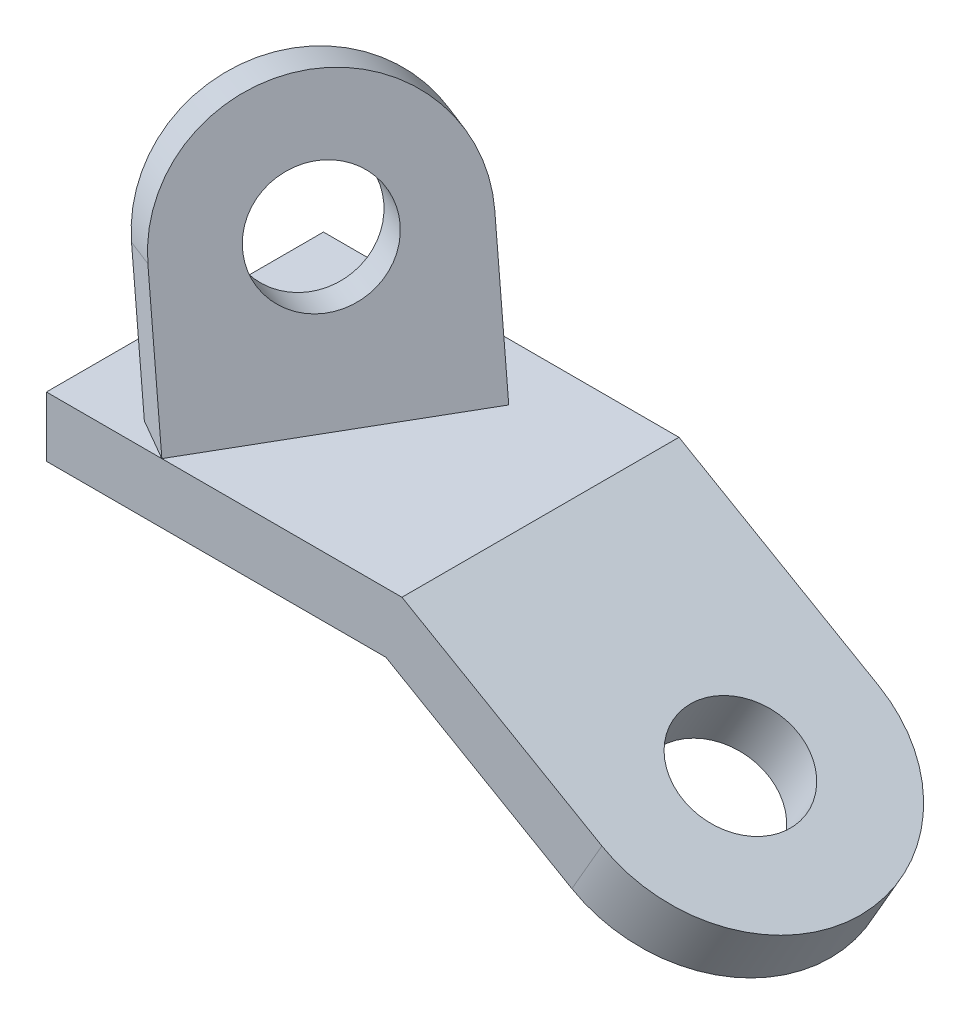
ISO-10303-21;
HEADER;
FILE_DESCRIPTION(('STEP AP214'),'2;1');
FILE_NAME('part.step','',(''),(''),'','','');
FILE_SCHEMA(('AUTOMOTIVE_DESIGN { 1 0 10303 214 1 1 1 1 }'));
ENDSEC;
DATA;
#1=APPLICATION_CONTEXT('core data for automotive mechanical design processes');
#2=APPLICATION_PROTOCOL_DEFINITION('international standard','automotive_design',2000,#1);
#3=PRODUCT_CONTEXT('',#1,'mechanical');
#4=PRODUCT('Part','Part','',(#3));
#5=PRODUCT_RELATED_PRODUCT_CATEGORY('part','',(#4));
#6=PRODUCT_DEFINITION_FORMATION('','',#4);
#7=PRODUCT_DEFINITION_CONTEXT('part definition',#1,'design');
#8=PRODUCT_DEFINITION('design','',#6,#7);
#9=PRODUCT_DEFINITION_SHAPE('','',#8);
#10=(LENGTH_UNIT() NAMED_UNIT(*) SI_UNIT(.MILLI.,.METRE.));
#11=(NAMED_UNIT(*) PLANE_ANGLE_UNIT() SI_UNIT($,.RADIAN.));
#12=(NAMED_UNIT(*) SI_UNIT($,.STERADIAN.) SOLID_ANGLE_UNIT());
#13=UNCERTAINTY_MEASURE_WITH_UNIT(LENGTH_MEASURE(1.E-05),#10,'distance_accuracy_value','');
#14=(GEOMETRIC_REPRESENTATION_CONTEXT(3) GLOBAL_UNCERTAINTY_ASSIGNED_CONTEXT((#13)) GLOBAL_UNIT_ASSIGNED_CONTEXT((#10,
#11,#12)) REPRESENTATION_CONTEXT('',''));
#15=CARTESIAN_POINT('',(0.,0.,0.));
#16=DIRECTION('',(0.,0.,1.));
#17=DIRECTION('',(1.,0.,0.));
#18=AXIS2_PLACEMENT_3D('',#15,#16,#17);
#19=CARTESIAN_POINT('',(0.,13.,-60.));
#20=DIRECTION('',(0.,1.,0.));
#21=DIRECTION('',(0.,0.,1.));
#22=AXIS2_PLACEMENT_3D('',#19,#20,#21);
#23=PLANE('',#22);
#24=DIRECTION('',(0.500000000000004,0.,-0.866025403784436));
#25=VECTOR('',#24,1.);
#26=CARTESIAN_POINT('',(35.7650073918527,13.,-39.3510633547447));
#27=LINE('',#26,#25);
#28=CARTESIAN_POINT('',(16.0342452783195,13.,-5.17638090205043));
#29=VERTEX_POINT('',#28);
#30=CARTESIAN_POINT('',(43.5342452783197,13.,-52.8077781101944));
#31=VERTEX_POINT('',#30);
#32=EDGE_CURVE('E57',#29,#31,#27,.T.);
#33=ORIENTED_EDGE('',*,*,#32,.T.);
#34=DIRECTION('',(0.866025403784436,0.,0.500000000000004));
#35=VECTOR('',#34,1.);
#36=CARTESIAN_POINT('',(7.76923788646702,13.,-73.4567147554498));
#37=LINE('',#36,#35);
#38=CARTESIAN_POINT('',(52.5000000000002,13.,-47.631397208144));
#39=VERTEX_POINT('',#38);
#40=EDGE_CURVE('E11',#31,#39,#37,.T.);
#41=ORIENTED_EDGE('',*,*,#40,.T.);
#42=DIRECTION('',(0.500000000000004,0.,-0.866025403784436));
#43=VECTOR('',#42,1.);
#44=CARTESIAN_POINT('',(18.7499999999999,13.,10.8253175473056));
#45=LINE('',#44,#43);
#46=CARTESIAN_POINT('',(25.,13.,0.));
#47=VERTEX_POINT('',#46);
#48=EDGE_CURVE('E167',#47,#39,#45,.T.);
#49=ORIENTED_EDGE('',*,*,#48,.F.);
#50=DIRECTION('',(-1.,0.,0.));
#51=VECTOR('',#50,1.);
#52=CARTESIAN_POINT('',(0.,13.,0.));
#53=LINE('',#52,#51);
#54=CARTESIAN_POINT('',(77.,13.,0.));
#55=VERTEX_POINT('',#54);
#56=EDGE_CURVE('E231',#55,#47,#53,.T.);
#57=ORIENTED_EDGE('',*,*,#56,.F.);
#58=DIRECTION('',(0.,0.,1.));
#59=VECTOR('',#58,1.);
#60=CARTESIAN_POINT('',(77.,13.,-60.));
#61=LINE('',#60,#59);
#62=CARTESIAN_POINT('',(77.,13.,-60.));
#63=VERTEX_POINT('',#62);
#64=EDGE_CURVE('E250',#63,#55,#61,.T.);
#65=ORIENTED_EDGE('',*,*,#64,.F.);
#66=DIRECTION('',(-1.,0.,0.));
#67=VECTOR('',#66,1.);
#68=CARTESIAN_POINT('',(0.,13.,-60.));
#69=LINE('',#68,#67);
#70=CARTESIAN_POINT('',(0.,13.,-60.));
#71=VERTEX_POINT('',#70);
#72=EDGE_CURVE('E209',#63,#71,#69,.T.);
#73=ORIENTED_EDGE('',*,*,#72,.T.);
#74=DIRECTION('',(0.,0.,1.));
#75=VECTOR('',#74,1.);
#76=CARTESIAN_POINT('',(0.,13.,-60.));
#77=LINE('',#76,#75);
#78=CARTESIAN_POINT('',(0.,13.,0.));
#79=VERTEX_POINT('',#78);
#80=EDGE_CURVE('E243',#71,#79,#77,.T.);
#81=ORIENTED_EDGE('',*,*,#80,.T.);
#82=EDGE_CURVE('E235',#47,#79,#53,.T.);
#83=ORIENTED_EDGE('',*,*,#82,.F.);
#84=DIRECTION('',(-0.866025403784436,0.,-0.500000000000004));
#85=VECTOR('',#84,1.);
#86=CARTESIAN_POINT('',(-19.7307621135332,13.,-25.8253175473058));
#87=LINE('',#86,#85);
#88=EDGE_CURVE('E67',#47,#29,#87,.T.);
#89=ORIENTED_EDGE('',*,*,#88,.T.);
#90=EDGE_LOOP('',(#33,#41,#49,#57,#65,#73,#81,#83,#89));
#91=FACE_BOUND('',#90,.T.);
#92=ADVANCED_FACE('F50',(#91),#23,.T.);
#93=CARTESIAN_POINT('',(113.801270189222,-23.2583302491976,-60.));
#94=DIRECTION('',(-0.499999999999998,-0.86602540378444,0.));
#95=DIRECTION('',(0.86602540378444,-0.499999999999998,0.));
#96=AXIS2_PLACEMENT_3D('',#93,#94,#95);
#97=PLANE('',#96);
#98=DIRECTION('',(0.86602540378444,-0.499999999999998,0.));
#99=VECTOR('',#98,1.);
#100=CARTESIAN_POINT('',(113.801270189222,-23.2583302491976,0.));
#101=LINE('',#100,#99);
#102=CARTESIAN_POINT('',(73.516660498395,2.7481294065646E-13,0.));
#103=VERTEX_POINT('',#102);
#104=CARTESIAN_POINT('',(113.801270189222,-23.2583302491976,0.));
#105=VERTEX_POINT('',#104);
#106=EDGE_CURVE('E225',#103,#105,#101,.T.);
#107=ORIENTED_EDGE('',*,*,#106,.F.);
#108=DIRECTION('',(0.,0.,1.));
#109=VECTOR('',#108,1.);
#110=CARTESIAN_POINT('',(73.516660498395,2.7481294065646E-13,-60.));
#111=LINE('',#110,#109);
#112=CARTESIAN_POINT('',(73.516660498395,2.7481294065646E-13,-60.));
#113=VERTEX_POINT('',#112);
#114=EDGE_CURVE('E217',#113,#103,#111,.T.);
#115=ORIENTED_EDGE('',*,*,#114,.F.);
#116=DIRECTION('',(0.86602540378444,-0.499999999999998,0.));
#117=VECTOR('',#116,1.);
#118=CARTESIAN_POINT('',(113.801270189222,-23.2583302491976,-60.));
#119=LINE('',#118,#117);
#120=CARTESIAN_POINT('',(113.801270189222,-23.2583302491976,-60.));
#121=VERTEX_POINT('',#120);
#122=EDGE_CURVE('E196',#113,#121,#119,.T.);
#123=ORIENTED_EDGE('',*,*,#122,.T.);
#124=CARTESIAN_POINT('',(113.801270189222,-23.2583302491976,-30.));
#125=DIRECTION('',(0.499999999999998,0.86602540378444,0.));
#126=DIRECTION('',(-0.86602540378444,0.499999999999998,0.));
#127=AXIS2_PLACEMENT_3D('',#124,#125,#126);
#128=CIRCLE('',#127,30.);
#129=EDGE_CURVE('E185',#121,#105,#128,.F.);
#130=ORIENTED_EDGE('',*,*,#129,.T.);
#131=EDGE_LOOP('',(#107,#115,#123,#130));
#132=FACE_BOUND('',#131,.T.);
#133=CARTESIAN_POINT('',(113.801270189222,-23.2583302491976,-30.));
#134=DIRECTION('',(0.499999999999998,0.86602540378444,0.));
#135=DIRECTION('',(-0.86602540378444,0.499999999999998,0.));
#136=AXIS2_PLACEMENT_3D('',#133,#134,#135);
#137=CIRCLE('',#136,12.5);
#138=CARTESIAN_POINT('',(102.975952641917,-17.0083302491976,-30.));
#139=VERTEX_POINT('',#138);
#140=EDGE_CURVE('E180',#139,#139,#137,.T.);
#141=ORIENTED_EDGE('',*,*,#140,.T.);
#142=EDGE_LOOP('',(#141));
#143=FACE_BOUND('',#142,.T.);
#144=ADVANCED_FACE('F268',(#132,#143),#97,.T.);
#145=CARTESIAN_POINT('',(73.516660498395,2.7481294065646E-13,-60.));
#146=DIRECTION('',(0.,-1.,0.));
#147=DIRECTION('',(1.,0.,0.));
#148=AXIS2_PLACEMENT_3D('',#145,#146,#147);
#149=PLANE('',#148);
#150=DIRECTION('',(1.,0.,0.));
#151=VECTOR('',#150,1.);
#152=CARTESIAN_POINT('',(73.516660498395,2.7481294065646E-13,0.));
#153=LINE('',#152,#151);
#154=CARTESIAN_POINT('',(0.,0.,0.));
#155=VERTEX_POINT('',#154);
#156=EDGE_CURVE('E190',#155,#103,#153,.T.);
#157=ORIENTED_EDGE('',*,*,#156,.F.);
#158=DIRECTION('',(0.,0.,1.));
#159=VECTOR('',#158,1.);
#160=CARTESIAN_POINT('',(0.,0.,-60.));
#161=LINE('',#160,#159);
#162=CARTESIAN_POINT('',(0.,0.,-60.));
#163=VERTEX_POINT('',#162);
#164=EDGE_CURVE('E241',#163,#155,#161,.T.);
#165=ORIENTED_EDGE('',*,*,#164,.F.);
#166=DIRECTION('',(1.,0.,0.));
#167=VECTOR('',#166,1.);
#168=CARTESIAN_POINT('',(73.516660498395,2.7481294065646E-13,-60.));
#169=LINE('',#168,#167);
#170=EDGE_CURVE('E191',#163,#113,#169,.T.);
#171=ORIENTED_EDGE('',*,*,#170,.T.);
#172=ORIENTED_EDGE('',*,*,#114,.T.);
#173=EDGE_LOOP('',(#157,#165,#171,#172));
#174=FACE_BOUND('',#173,.T.);
#175=ADVANCED_FACE('F47',(#174),#149,.T.);
#176=CARTESIAN_POINT('',(0.,0.,-60.));
#177=DIRECTION('',(-1.,0.,0.));
#178=DIRECTION('',(0.,0.,1.));
#179=AXIS2_PLACEMENT_3D('',#176,#177,#178);
#180=PLANE('',#179);
#181=DIRECTION('',(0.,-1.,0.));
#182=VECTOR('',#181,1.);
#183=CARTESIAN_POINT('',(0.,0.,0.));
#184=LINE('',#183,#182);
#185=EDGE_CURVE('E200',#79,#155,#184,.T.);
#186=ORIENTED_EDGE('',*,*,#185,.F.);
#187=ORIENTED_EDGE('',*,*,#80,.F.);
#188=DIRECTION('',(0.,-1.,0.));
#189=VECTOR('',#188,1.);
#190=CARTESIAN_POINT('',(0.,0.,-60.));
#191=LINE('',#190,#189);
#192=EDGE_CURVE('E212',#71,#163,#191,.T.);
#193=ORIENTED_EDGE('',*,*,#192,.T.);
#194=ORIENTED_EDGE('',*,*,#164,.T.);
#195=EDGE_LOOP('',(#186,#187,#193,#194));
#196=FACE_BOUND('',#195,.T.);
#197=ADVANCED_FACE('F261',(#196),#180,.T.);
#198=CARTESIAN_POINT('',(77.,13.,-60.));
#199=DIRECTION('',(0.499999999999997,0.86602540378444,0.));
#200=DIRECTION('',(-0.86602540378444,0.499999999999997,0.));
#201=AXIS2_PLACEMENT_3D('',#198,#199,#200);
#202=PLANE('',#201);
#203=CARTESIAN_POINT('',(120.301270189222,-11.9999999999999,-30.));
#204=DIRECTION('',(0.499999999999998,0.86602540378444,0.));
#205=DIRECTION('',(-0.86602540378444,0.499999999999998,0.));
#206=AXIS2_PLACEMENT_3D('',#203,#204,#205);
#207=CIRCLE('',#206,12.5);
#208=CARTESIAN_POINT('',(109.475952641917,-5.74999999999989,-30.));
#209=VERTEX_POINT('',#208);
#210=EDGE_CURVE('E179',#209,#209,#207,.T.);
#211=ORIENTED_EDGE('',*,*,#210,.F.);
#212=EDGE_LOOP('',(#211));
#213=FACE_BOUND('',#212,.T.);
#214=DIRECTION('',(-0.86602540378444,0.499999999999997,0.));
#215=VECTOR('',#214,1.);
#216=CARTESIAN_POINT('',(77.,13.,0.));
#217=LINE('',#216,#215);
#218=CARTESIAN_POINT('',(120.301270189222,-11.9999999999999,0.));
#219=VERTEX_POINT('',#218);
#220=EDGE_CURVE('E228',#219,#55,#217,.T.);
#221=ORIENTED_EDGE('',*,*,#220,.F.);
#222=CARTESIAN_POINT('',(120.301270189222,-11.9999999999999,-30.));
#223=DIRECTION('',(0.499999999999998,0.86602540378444,0.));
#224=DIRECTION('',(-0.86602540378444,0.499999999999998,0.));
#225=AXIS2_PLACEMENT_3D('',#222,#223,#224);
#226=CIRCLE('',#225,30.);
#227=CARTESIAN_POINT('',(120.301270189222,-11.9999999999999,-60.));
#228=VERTEX_POINT('',#227);
#229=EDGE_CURVE('E181',#228,#219,#226,.F.);
#230=ORIENTED_EDGE('',*,*,#229,.F.);
#231=DIRECTION('',(-0.86602540378444,0.499999999999997,0.));
#232=VECTOR('',#231,1.);
#233=CARTESIAN_POINT('',(77.,13.,-60.));
#234=LINE('',#233,#232);
#235=EDGE_CURVE('E206',#228,#63,#234,.T.);
#236=ORIENTED_EDGE('',*,*,#235,.T.);
#237=ORIENTED_EDGE('',*,*,#64,.T.);
#238=EDGE_LOOP('',(#221,#230,#236,#237));
#239=FACE_BOUND('',#238,.T.);
#240=ADVANCED_FACE('F280',(#213,#239),#202,.T.);
#241=CARTESIAN_POINT('',(0.,0.,-60.));
#242=DIRECTION('',(0.,0.,-1.));
#243=DIRECTION('',(-1.,0.,0.));
#244=AXIS2_PLACEMENT_3D('',#241,#242,#243);
#245=PLANE('',#244);
#246=ORIENTED_EDGE('',*,*,#170,.F.);
#247=ORIENTED_EDGE('',*,*,#192,.F.);
#248=ORIENTED_EDGE('',*,*,#72,.F.);
#249=ORIENTED_EDGE('',*,*,#235,.F.);
#250=DIRECTION('',(0.499999999999998,0.866025403784439,0.));
#251=VECTOR('',#250,1.);
#252=CARTESIAN_POINT('',(120.301270189222,-11.9999999999999,-60.));
#253=LINE('',#252,#251);
#254=EDGE_CURVE('E201',#121,#228,#253,.T.);
#255=ORIENTED_EDGE('',*,*,#254,.F.);
#256=ORIENTED_EDGE('',*,*,#122,.F.);
#257=EDGE_LOOP('',(#246,#247,#248,#249,#255,#256));
#258=FACE_BOUND('',#257,.T.);
#259=ADVANCED_FACE('F276',(#258),#245,.T.);
#260=CARTESIAN_POINT('',(0.,0.,0.));
#261=DIRECTION('',(0.,0.,-1.));
#262=DIRECTION('',(-1.,0.,0.));
#263=AXIS2_PLACEMENT_3D('',#260,#261,#262);
#264=PLANE('',#263);
#265=ORIENTED_EDGE('',*,*,#156,.T.);
#266=ORIENTED_EDGE('',*,*,#106,.T.);
#267=DIRECTION('',(0.499999999999998,0.866025403784439,0.));
#268=VECTOR('',#267,1.);
#269=CARTESIAN_POINT('',(120.301270189222,-11.9999999999999,0.));
#270=LINE('',#269,#268);
#271=EDGE_CURVE('E223',#105,#219,#270,.T.);
#272=ORIENTED_EDGE('',*,*,#271,.T.);
#273=ORIENTED_EDGE('',*,*,#220,.T.);
#274=ORIENTED_EDGE('',*,*,#56,.T.);
#275=ORIENTED_EDGE('',*,*,#82,.T.);
#276=ORIENTED_EDGE('',*,*,#185,.T.);
#277=EDGE_LOOP('',(#265,#266,#272,#273,#274,#275,#276));
#278=FACE_BOUND('',#277,.T.);
#279=ADVANCED_FACE('F254',(#278),#264,.F.);
#280=CARTESIAN_POINT('',(113.801270189222,-23.2583302491976,-30.));
#281=DIRECTION('',(0.499999999999998,0.86602540378444,0.));
#282=DIRECTION('',(-0.86602540378444,0.499999999999998,0.));
#283=AXIS2_PLACEMENT_3D('',#280,#281,#282);
#284=CYLINDRICAL_SURFACE('',#283,12.5);
#285=ORIENTED_EDGE('',*,*,#210,.T.);
#286=EDGE_LOOP('',(#285));
#287=FACE_BOUND('',#286,.T.);
#288=ORIENTED_EDGE('',*,*,#140,.F.);
#289=EDGE_LOOP('',(#288));
#290=FACE_BOUND('',#289,.T.);
#291=ADVANCED_FACE('F289',(#287,#290),#284,.F.);
#292=CARTESIAN_POINT('',(113.801270189222,-23.2583302491976,-30.));
#293=DIRECTION('',(0.499999999999998,0.86602540378444,0.));
#294=DIRECTION('',(-0.86602540378444,0.499999999999998,0.));
#295=AXIS2_PLACEMENT_3D('',#292,#293,#294);
#296=CYLINDRICAL_SURFACE('',#295,30.);
#297=ORIENTED_EDGE('',*,*,#229,.T.);
#298=ORIENTED_EDGE('',*,*,#271,.F.);
#299=ORIENTED_EDGE('',*,*,#129,.F.);
#300=ORIENTED_EDGE('',*,*,#254,.T.);
#301=EDGE_LOOP('',(#297,#298,#299,#300));
#302=FACE_BOUND('',#301,.T.);
#303=ADVANCED_FACE('F272',(#302),#296,.T.);
#304=CARTESIAN_POINT('',(23.2122331852777,41.321435990225,-32.7864324571577));
#305=DIRECTION('',(0.836516303737806,0.258819045102518,0.482962913144539));
#306=DIRECTION('',(0.500000000000004,0.,-0.866025403784436));
#307=AXIS2_PLACEMENT_3D('',#304,#305,#306);
#308=CYLINDRICAL_SURFACE('',#307,27.5);
#309=CARTESIAN_POINT('',(31.5773962226558,43.9096264412502,-27.9568033257123));
#310=DIRECTION('',(0.836516303737806,0.258819045102518,0.482962913144538));
#311=DIRECTION('',(0.500000000000004,0.,-0.866025403784436));
#312=AXIS2_PLACEMENT_3D('',#309,#310,#311);
#313=CIRCLE('',#312,27.5);
#314=CARTESIAN_POINT('',(17.8273962226557,43.9096264412502,-4.14110472164032));
#315=VERTEX_POINT('',#314);
#316=CARTESIAN_POINT('',(45.3273962226559,43.9096264412502,-51.7725019297843));
#317=VERTEX_POINT('',#316);
#318=EDGE_CURVE('E161',#315,#317,#313,.F.);
#319=ORIENTED_EDGE('',*,*,#318,.T.);
#320=DIRECTION('',(0.836516303737806,0.258819045102518,0.482962913144539));
#321=VECTOR('',#320,1.);
#322=CARTESIAN_POINT('',(36.9622331852778,41.321435990225,-56.6021310612297));
#323=LINE('',#322,#321);
#324=CARTESIAN_POINT('',(36.9622331852778,41.321435990225,-56.6021310612297));
#325=VERTEX_POINT('',#324);
#326=EDGE_CURVE('E141',#325,#317,#323,.T.);
#327=ORIENTED_EDGE('',*,*,#326,.F.);
#328=CARTESIAN_POINT('',(23.2122331852777,41.321435990225,-32.7864324571577));
#329=DIRECTION('',(0.836516303737806,0.258819045102518,0.482962913144538));
#330=DIRECTION('',(0.500000000000004,0.,-0.866025403784436));
#331=AXIS2_PLACEMENT_3D('',#328,#329,#330);
#332=CIRCLE('',#331,27.5);
#333=CARTESIAN_POINT('',(9.46223318527761,41.321435990225,-8.9707338530857));
#334=VERTEX_POINT('',#333);
#335=EDGE_CURVE('E126',#334,#325,#332,.F.);
#336=ORIENTED_EDGE('',*,*,#335,.F.);
#337=DIRECTION('',(0.836516303737806,0.258819045102518,0.482962913144539));
#338=VECTOR('',#337,1.);
#339=CARTESIAN_POINT('',(9.46223318527761,41.321435990225,-8.9707338530857));
#340=LINE('',#339,#338);
#341=EDGE_CURVE('E134',#334,#315,#340,.T.);
#342=ORIENTED_EDGE('',*,*,#341,.T.);
#343=EDGE_LOOP('',(#319,#327,#336,#342));
#344=FACE_BOUND('',#343,.T.);
#345=ADVANCED_FACE('F144',(#344),#308,.T.);
#346=CARTESIAN_POINT('',(45.6934076854007,3.69530319802862,-51.5611851132421));
#347=DIRECTION('',(-0.500000000000004,0.,0.866025403784436));
#348=DIRECTION('',(0.866025403784436,0.,0.500000000000004));
#349=AXIS2_PLACEMENT_3D('',#346,#347,#348);
#350=PLANE('',#349);
#351=ORIENTED_EDGE('',*,*,#40,.F.);
#352=DIRECTION('',(0.22414386804201,-0.965925826289069,0.12940952255126));
#353=VECTOR('',#352,1.);
#354=CARTESIAN_POINT('',(45.6934076854007,3.69530319802862,-51.5611851132421));
#355=LINE('',#354,#353);
#356=EDGE_CURVE('E135',#325,#31,#355,.T.);
#357=ORIENTED_EDGE('',*,*,#356,.F.);
#358=ORIENTED_EDGE('',*,*,#326,.T.);
#359=DIRECTION('',(0.22414386804201,-0.965925826289069,0.12940952255126));
#360=VECTOR('',#359,1.);
#361=CARTESIAN_POINT('',(54.0585707227788,6.2834936490538,-46.7315559817967));
#362=LINE('',#361,#360);
#363=EDGE_CURVE('E155',#317,#39,#362,.T.);
#364=ORIENTED_EDGE('',*,*,#363,.T.);
#365=EDGE_LOOP('',(#351,#357,#358,#364));
#366=FACE_BOUND('',#365,.T.);
#367=ADVANCED_FACE('F340',(#366),#350,.F.);
#368=CARTESIAN_POINT('',(23.2122331852777,41.321435990225,-32.7864324571577));
#369=DIRECTION('',(0.836516303737806,0.258819045102518,0.482962913144539));
#370=DIRECTION('',(0.500000000000004,0.,-0.866025403784436));
#371=AXIS2_PLACEMENT_3D('',#368,#369,#370);
#372=CYLINDRICAL_SURFACE('',#371,12.5);
#373=CARTESIAN_POINT('',(23.2122331852777,41.321435990225,-32.7864324571577));
#374=DIRECTION('',(0.836516303737806,0.258819045102518,0.482962913144538));
#375=DIRECTION('',(0.500000000000004,0.,-0.866025403784436));
#376=AXIS2_PLACEMENT_3D('',#373,#374,#375);
#377=CIRCLE('',#376,12.5);
#378=CARTESIAN_POINT('',(29.4622331852778,41.321435990225,-43.6117500044631));
#379=VERTEX_POINT('',#378);
#380=EDGE_CURVE('E146',#379,#379,#377,.T.);
#381=ORIENTED_EDGE('',*,*,#380,.F.);
#382=EDGE_LOOP('',(#381));
#383=FACE_BOUND('',#382,.T.);
#384=CARTESIAN_POINT('',(31.5773962226558,43.9096264412502,-27.9568033257123));
#385=DIRECTION('',(0.836516303737806,0.258819045102518,0.482962913144538));
#386=DIRECTION('',(0.500000000000004,0.,-0.866025403784436));
#387=AXIS2_PLACEMENT_3D('',#384,#385,#386);
#388=CIRCLE('',#387,12.5);
#389=CARTESIAN_POINT('',(37.8273962226558,43.9096264412502,-38.7821208730178));
#390=VERTEX_POINT('',#389);
#391=EDGE_CURVE('E160',#390,#390,#388,.T.);
#392=ORIENTED_EDGE('',*,*,#391,.T.);
#393=EDGE_LOOP('',(#392));
#394=FACE_BOUND('',#393,.T.);
#395=ADVANCED_FACE('F347',(#383,#394),#372,.F.);
#396=CARTESIAN_POINT('',(18.1934076854005,3.69530319802863,-3.9297879050981));
#397=DIRECTION('',(0.500000000000004,0.,-0.866025403784436));
#398=DIRECTION('',(-0.866025403784436,0.,-0.500000000000004));
#399=AXIS2_PLACEMENT_3D('',#396,#397,#398);
#400=PLANE('',#399);
#401=ORIENTED_EDGE('',*,*,#88,.F.);
#402=DIRECTION('',(-0.22414386804201,0.965925826289069,-0.12940952255126));
#403=VECTOR('',#402,1.);
#404=CARTESIAN_POINT('',(26.5585707227786,6.28349364905381,0.899841226347287));
#405=LINE('',#404,#403);
#406=EDGE_CURVE('E140',#47,#315,#405,.T.);
#407=ORIENTED_EDGE('',*,*,#406,.T.);
#408=ORIENTED_EDGE('',*,*,#341,.F.);
#409=DIRECTION('',(-0.22414386804201,0.965925826289069,-0.12940952255126));
#410=VECTOR('',#409,1.);
#411=CARTESIAN_POINT('',(18.1934076854005,3.69530319802863,-3.9297879050981));
#412=LINE('',#411,#410);
#413=EDGE_CURVE('E124',#29,#334,#412,.T.);
#414=ORIENTED_EDGE('',*,*,#413,.F.);
#415=EDGE_LOOP('',(#401,#407,#408,#414));
#416=FACE_BOUND('',#415,.T.);
#417=ADVANCED_FACE('F137',(#416),#400,.F.);
#418=CARTESIAN_POINT('',(11.9434076854004,3.69530319802863,6.89552964220744));
#419=DIRECTION('',(0.836516303737806,0.258819045102518,0.482962913144538));
#420=DIRECTION('',(0.500000000000004,0.,-0.866025403784436));
#421=AXIS2_PLACEMENT_3D('',#418,#419,#420);
#422=PLANE('',#421);
#423=ORIENTED_EDGE('',*,*,#32,.F.);
#424=ORIENTED_EDGE('',*,*,#413,.T.);
#425=ORIENTED_EDGE('',*,*,#335,.T.);
#426=ORIENTED_EDGE('',*,*,#356,.T.);
#427=EDGE_LOOP('',(#423,#424,#425,#426));
#428=FACE_BOUND('',#427,.T.);
#429=ORIENTED_EDGE('',*,*,#380,.T.);
#430=EDGE_LOOP('',(#429));
#431=FACE_BOUND('',#430,.T.);
#432=ADVANCED_FACE('F121',(#428,#431),#422,.F.);
#433=CARTESIAN_POINT('',(20.3085707227785,6.28349364905381,11.7251587736528));
#434=DIRECTION('',(0.836516303737806,0.258819045102518,0.482962913144538));
#435=DIRECTION('',(0.500000000000004,0.,-0.866025403784436));
#436=AXIS2_PLACEMENT_3D('',#433,#434,#435);
#437=PLANE('',#436);
#438=ORIENTED_EDGE('',*,*,#391,.F.);
#439=EDGE_LOOP('',(#438));
#440=FACE_BOUND('',#439,.T.);
#441=ORIENTED_EDGE('',*,*,#318,.F.);
#442=ORIENTED_EDGE('',*,*,#406,.F.);
#443=ORIENTED_EDGE('',*,*,#48,.T.);
#444=ORIENTED_EDGE('',*,*,#363,.F.);
#445=EDGE_LOOP('',(#441,#442,#443,#444));
#446=FACE_BOUND('',#445,.T.);
#447=ADVANCED_FACE('F371',(#440,#446),#437,.T.);
#448=CLOSED_SHELL('',(#92,#144,#175,#197,#240,#259,#279,#291,#303,#345,#367,#395,#417,#432,#447));
#449=MANIFOLD_SOLID_BREP('B2',#448);
#450=ADVANCED_BREP_SHAPE_REPRESENTATION('',(#18,#449),#14);
#451=SHAPE_DEFINITION_REPRESENTATION(#9,#450);
ENDSEC;
END-ISO-10303-21;
